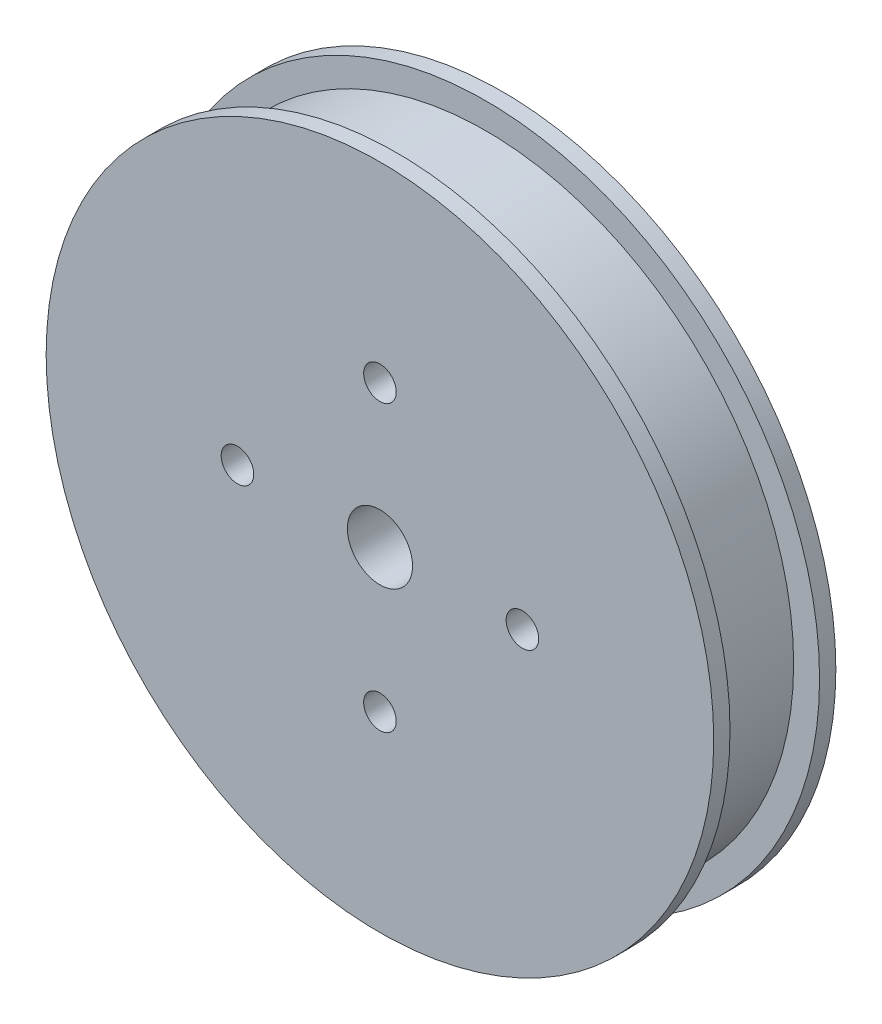
ISO-10303-21;
HEADER;
FILE_DESCRIPTION(('STEP AP214'),'2;1');
FILE_NAME('part.step','',(''),(''),'','','');
FILE_SCHEMA(('AUTOMOTIVE_DESIGN { 1 0 10303 214 1 1 1 1 }'));
ENDSEC;
DATA;
#1=APPLICATION_CONTEXT('core data for automotive mechanical design processes');
#2=APPLICATION_PROTOCOL_DEFINITION('international standard','automotive_design',2000,#1);
#3=PRODUCT_CONTEXT('',#1,'mechanical');
#4=PRODUCT('Part','Part','',(#3));
#5=PRODUCT_RELATED_PRODUCT_CATEGORY('part','',(#4));
#6=PRODUCT_DEFINITION_FORMATION('','',#4);
#7=PRODUCT_DEFINITION_CONTEXT('part definition',#1,'design');
#8=PRODUCT_DEFINITION('design','',#6,#7);
#9=PRODUCT_DEFINITION_SHAPE('','',#8);
#10=(LENGTH_UNIT() NAMED_UNIT(*) SI_UNIT(.MILLI.,.METRE.));
#11=(NAMED_UNIT(*) PLANE_ANGLE_UNIT() SI_UNIT($,.RADIAN.));
#12=(NAMED_UNIT(*) SI_UNIT($,.STERADIAN.) SOLID_ANGLE_UNIT());
#13=UNCERTAINTY_MEASURE_WITH_UNIT(LENGTH_MEASURE(1.E-05),#10,'distance_accuracy_value','');
#14=(GEOMETRIC_REPRESENTATION_CONTEXT(3) GLOBAL_UNCERTAINTY_ASSIGNED_CONTEXT((#13)) GLOBAL_UNIT_ASSIGNED_CONTEXT((#10,
#11,#12)) REPRESENTATION_CONTEXT('',''));
#15=CARTESIAN_POINT('',(0.,0.,0.));
#16=DIRECTION('',(0.,0.,1.));
#17=DIRECTION('',(1.,0.,0.));
#18=AXIS2_PLACEMENT_3D('',#15,#16,#17);
#19=CARTESIAN_POINT('',(0.,0.,15.));
#20=DIRECTION('',(0.,0.,-1.));
#21=DIRECTION('',(-1.,0.,0.));
#22=AXIS2_PLACEMENT_3D('',#19,#20,#21);
#23=CYLINDRICAL_SURFACE('',#22,41.);
#24=CARTESIAN_POINT('',(0.,0.,0.));
#25=DIRECTION('',(0.,0.,1.));
#26=DIRECTION('',(1.,0.,0.));
#27=AXIS2_PLACEMENT_3D('',#24,#25,#26);
#28=CIRCLE('',#27,41.);
#29=CARTESIAN_POINT('',(41.,0.,0.));
#30=VERTEX_POINT('',#29);
#31=EDGE_CURVE('E35',#30,#30,#28,.T.);
#32=ORIENTED_EDGE('',*,*,#31,.T.);
#33=EDGE_LOOP('',(#32));
#34=FACE_BOUND('',#33,.T.);
#35=CARTESIAN_POINT('',(0.,0.,2.));
#36=DIRECTION('',(0.,0.,1.));
#37=DIRECTION('',(1.,0.,0.));
#38=AXIS2_PLACEMENT_3D('',#35,#36,#37);
#39=CIRCLE('',#38,41.);
#40=CARTESIAN_POINT('',(41.,0.,2.));
#41=VERTEX_POINT('',#40);
#42=EDGE_CURVE('E71',#41,#41,#39,.T.);
#43=ORIENTED_EDGE('',*,*,#42,.F.);
#44=EDGE_LOOP('',(#43));
#45=FACE_BOUND('',#44,.T.);
#46=ADVANCED_FACE('F31',(#34,#45),#23,.T.);
#47=CARTESIAN_POINT('',(0.,0.,15.));
#48=DIRECTION('',(0.,0.,1.));
#49=DIRECTION('',(1.,0.,0.));
#50=AXIS2_PLACEMENT_3D('',#47,#48,#49);
#51=PLANE('',#50);
#52=CARTESIAN_POINT('',(17.5,0.,15.));
#53=DIRECTION('',(0.,0.,1.));
#54=DIRECTION('',(1.,0.,0.));
#55=AXIS2_PLACEMENT_3D('',#52,#53,#54);
#56=CIRCLE('',#55,2.);
#57=CARTESIAN_POINT('',(19.5,0.,15.));
#58=VERTEX_POINT('',#57);
#59=EDGE_CURVE('E59',#58,#58,#56,.T.);
#60=ORIENTED_EDGE('',*,*,#59,.F.);
#61=EDGE_LOOP('',(#60));
#62=FACE_BOUND('',#61,.T.);
#63=CARTESIAN_POINT('',(-17.5,0.,15.));
#64=DIRECTION('',(0.,0.,1.));
#65=DIRECTION('',(1.,0.,0.));
#66=AXIS2_PLACEMENT_3D('',#63,#64,#65);
#67=CIRCLE('',#66,2.);
#68=CARTESIAN_POINT('',(-15.5,0.,15.));
#69=VERTEX_POINT('',#68);
#70=EDGE_CURVE('E47',#69,#69,#67,.T.);
#71=ORIENTED_EDGE('',*,*,#70,.F.);
#72=EDGE_LOOP('',(#71));
#73=FACE_BOUND('',#72,.T.);
#74=CARTESIAN_POINT('',(0.,0.,15.));
#75=DIRECTION('',(0.,0.,1.));
#76=DIRECTION('',(1.,0.,0.));
#77=AXIS2_PLACEMENT_3D('',#74,#75,#76);
#78=CIRCLE('',#77,41.);
#79=CARTESIAN_POINT('',(41.,0.,15.));
#80=VERTEX_POINT('',#79);
#81=EDGE_CURVE('E10',#80,#80,#78,.T.);
#82=ORIENTED_EDGE('',*,*,#81,.T.);
#83=EDGE_LOOP('',(#82));
#84=FACE_BOUND('',#83,.T.);
#85=CARTESIAN_POINT('',(0.,0.,15.));
#86=DIRECTION('',(0.,0.,1.));
#87=DIRECTION('',(1.,0.,0.));
#88=AXIS2_PLACEMENT_3D('',#85,#86,#87);
#89=CIRCLE('',#88,4.);
#90=CARTESIAN_POINT('',(4.,0.,15.));
#91=VERTEX_POINT('',#90);
#92=EDGE_CURVE('E42',#91,#91,#89,.T.);
#93=ORIENTED_EDGE('',*,*,#92,.F.);
#94=EDGE_LOOP('',(#93));
#95=FACE_BOUND('',#94,.T.);
#96=CARTESIAN_POINT('',(0.,17.5,15.));
#97=DIRECTION('',(0.,0.,1.));
#98=DIRECTION('',(1.,0.,0.));
#99=AXIS2_PLACEMENT_3D('',#96,#97,#98);
#100=CIRCLE('',#99,2.);
#101=CARTESIAN_POINT('',(2.,17.5,15.));
#102=VERTEX_POINT('',#101);
#103=EDGE_CURVE('E53',#102,#102,#100,.T.);
#104=ORIENTED_EDGE('',*,*,#103,.F.);
#105=EDGE_LOOP('',(#104));
#106=FACE_BOUND('',#105,.T.);
#107=CARTESIAN_POINT('',(0.,-17.5,15.));
#108=DIRECTION('',(0.,0.,1.));
#109=DIRECTION('',(1.,0.,0.));
#110=AXIS2_PLACEMENT_3D('',#107,#108,#109);
#111=CIRCLE('',#110,2.);
#112=CARTESIAN_POINT('',(2.,-17.5,15.));
#113=VERTEX_POINT('',#112);
#114=EDGE_CURVE('E65',#113,#113,#111,.T.);
#115=ORIENTED_EDGE('',*,*,#114,.F.);
#116=EDGE_LOOP('',(#115));
#117=FACE_BOUND('',#116,.T.);
#118=ADVANCED_FACE('F98',(#62,#73,#84,#95,#106,#117),#51,.T.);
#119=CARTESIAN_POINT('',(0.,0.,0.));
#120=DIRECTION('',(0.,0.,1.));
#121=DIRECTION('',(1.,0.,0.));
#122=AXIS2_PLACEMENT_3D('',#119,#120,#121);
#123=PLANE('',#122);
#124=ORIENTED_EDGE('',*,*,#31,.F.);
#125=EDGE_LOOP('',(#124));
#126=FACE_BOUND('',#125,.T.);
#127=CARTESIAN_POINT('',(0.,0.,0.));
#128=DIRECTION('',(0.,0.,1.));
#129=DIRECTION('',(1.,0.,0.));
#130=AXIS2_PLACEMENT_3D('',#127,#128,#129);
#131=CIRCLE('',#130,4.);
#132=CARTESIAN_POINT('',(4.,0.,0.));
#133=VERTEX_POINT('',#132);
#134=EDGE_CURVE('E44',#133,#133,#131,.T.);
#135=ORIENTED_EDGE('',*,*,#134,.T.);
#136=EDGE_LOOP('',(#135));
#137=FACE_BOUND('',#136,.T.);
#138=CARTESIAN_POINT('',(-17.5,0.,0.));
#139=DIRECTION('',(0.,0.,1.));
#140=DIRECTION('',(1.,0.,0.));
#141=AXIS2_PLACEMENT_3D('',#138,#139,#140);
#142=CIRCLE('',#141,2.);
#143=CARTESIAN_POINT('',(-15.5,0.,0.));
#144=VERTEX_POINT('',#143);
#145=EDGE_CURVE('E50',#144,#144,#142,.T.);
#146=ORIENTED_EDGE('',*,*,#145,.T.);
#147=EDGE_LOOP('',(#146));
#148=FACE_BOUND('',#147,.T.);
#149=CARTESIAN_POINT('',(0.,17.5,0.));
#150=DIRECTION('',(0.,0.,1.));
#151=DIRECTION('',(1.,0.,0.));
#152=AXIS2_PLACEMENT_3D('',#149,#150,#151);
#153=CIRCLE('',#152,2.);
#154=CARTESIAN_POINT('',(2.,17.5,0.));
#155=VERTEX_POINT('',#154);
#156=EDGE_CURVE('E56',#155,#155,#153,.T.);
#157=ORIENTED_EDGE('',*,*,#156,.T.);
#158=EDGE_LOOP('',(#157));
#159=FACE_BOUND('',#158,.T.);
#160=CARTESIAN_POINT('',(17.5,0.,0.));
#161=DIRECTION('',(0.,0.,1.));
#162=DIRECTION('',(1.,0.,0.));
#163=AXIS2_PLACEMENT_3D('',#160,#161,#162);
#164=CIRCLE('',#163,2.);
#165=CARTESIAN_POINT('',(19.5,0.,0.));
#166=VERTEX_POINT('',#165);
#167=EDGE_CURVE('E62',#166,#166,#164,.T.);
#168=ORIENTED_EDGE('',*,*,#167,.T.);
#169=EDGE_LOOP('',(#168));
#170=FACE_BOUND('',#169,.T.);
#171=CARTESIAN_POINT('',(0.,-17.5,0.));
#172=DIRECTION('',(0.,0.,1.));
#173=DIRECTION('',(1.,0.,0.));
#174=AXIS2_PLACEMENT_3D('',#171,#172,#173);
#175=CIRCLE('',#174,2.);
#176=CARTESIAN_POINT('',(2.,-17.5,0.));
#177=VERTEX_POINT('',#176);
#178=EDGE_CURVE('E68',#177,#177,#175,.T.);
#179=ORIENTED_EDGE('',*,*,#178,.T.);
#180=EDGE_LOOP('',(#179));
#181=FACE_BOUND('',#180,.T.);
#182=ADVANCED_FACE('F103',(#126,#137,#148,#159,#170,#181),#123,.F.);
#183=CARTESIAN_POINT('',(0.,0.,13.));
#184=DIRECTION('',(0.,0.,1.));
#185=DIRECTION('',(1.,0.,0.));
#186=AXIS2_PLACEMENT_3D('',#183,#184,#185);
#187=CIRCLE('',#186,41.);
#188=CARTESIAN_POINT('',(41.,0.,13.));
#189=VERTEX_POINT('',#188);
#190=EDGE_CURVE('E74',#189,#189,#187,.T.);
#191=ORIENTED_EDGE('',*,*,#190,.T.);
#192=EDGE_LOOP('',(#191));
#193=FACE_BOUND('',#192,.T.);
#194=ORIENTED_EDGE('',*,*,#81,.F.);
#195=EDGE_LOOP('',(#194));
#196=FACE_BOUND('',#195,.T.);
#197=ADVANCED_FACE('F33',(#193,#196),#23,.T.);
#198=CARTESIAN_POINT('',(0.,0.,15.));
#199=DIRECTION('',(0.,0.,-1.));
#200=DIRECTION('',(-1.,0.,0.));
#201=AXIS2_PLACEMENT_3D('',#198,#199,#200);
#202=CYLINDRICAL_SURFACE('',#201,4.);
#203=ORIENTED_EDGE('',*,*,#92,.T.);
#204=EDGE_LOOP('',(#203));
#205=FACE_BOUND('',#204,.T.);
#206=ORIENTED_EDGE('',*,*,#134,.F.);
#207=EDGE_LOOP('',(#206));
#208=FACE_BOUND('',#207,.T.);
#209=ADVANCED_FACE('F107',(#205,#208),#202,.F.);
#210=CARTESIAN_POINT('',(-17.5,0.,15.));
#211=DIRECTION('',(0.,0.,-1.));
#212=DIRECTION('',(-1.,0.,0.));
#213=AXIS2_PLACEMENT_3D('',#210,#211,#212);
#214=CYLINDRICAL_SURFACE('',#213,2.);
#215=ORIENTED_EDGE('',*,*,#70,.T.);
#216=EDGE_LOOP('',(#215));
#217=FACE_BOUND('',#216,.T.);
#218=ORIENTED_EDGE('',*,*,#145,.F.);
#219=EDGE_LOOP('',(#218));
#220=FACE_BOUND('',#219,.T.);
#221=ADVANCED_FACE('F113',(#217,#220),#214,.F.);
#222=CARTESIAN_POINT('',(0.,17.5,15.));
#223=DIRECTION('',(0.,0.,-1.));
#224=DIRECTION('',(-1.,0.,0.));
#225=AXIS2_PLACEMENT_3D('',#222,#223,#224);
#226=CYLINDRICAL_SURFACE('',#225,2.);
#227=ORIENTED_EDGE('',*,*,#103,.T.);
#228=EDGE_LOOP('',(#227));
#229=FACE_BOUND('',#228,.T.);
#230=ORIENTED_EDGE('',*,*,#156,.F.);
#231=EDGE_LOOP('',(#230));
#232=FACE_BOUND('',#231,.T.);
#233=ADVANCED_FACE('F134',(#229,#232),#226,.F.);
#234=CARTESIAN_POINT('',(17.5,0.,15.));
#235=DIRECTION('',(0.,0.,-1.));
#236=DIRECTION('',(-1.,0.,0.));
#237=AXIS2_PLACEMENT_3D('',#234,#235,#236);
#238=CYLINDRICAL_SURFACE('',#237,2.);
#239=ORIENTED_EDGE('',*,*,#59,.T.);
#240=EDGE_LOOP('',(#239));
#241=FACE_BOUND('',#240,.T.);
#242=ORIENTED_EDGE('',*,*,#167,.F.);
#243=EDGE_LOOP('',(#242));
#244=FACE_BOUND('',#243,.T.);
#245=ADVANCED_FACE('F130',(#241,#244),#238,.F.);
#246=CARTESIAN_POINT('',(0.,-17.5,15.));
#247=DIRECTION('',(0.,0.,-1.));
#248=DIRECTION('',(-1.,0.,0.));
#249=AXIS2_PLACEMENT_3D('',#246,#247,#248);
#250=CYLINDRICAL_SURFACE('',#249,2.);
#251=ORIENTED_EDGE('',*,*,#114,.T.);
#252=EDGE_LOOP('',(#251));
#253=FACE_BOUND('',#252,.T.);
#254=ORIENTED_EDGE('',*,*,#178,.F.);
#255=EDGE_LOOP('',(#254));
#256=FACE_BOUND('',#255,.T.);
#257=ADVANCED_FACE('F93',(#253,#256),#250,.F.);
#258=CARTESIAN_POINT('',(0.,0.,2.));
#259=DIRECTION('',(0.,0.,1.));
#260=DIRECTION('',(1.,0.,0.));
#261=AXIS2_PLACEMENT_3D('',#258,#259,#260);
#262=PLANE('',#261);
#263=CARTESIAN_POINT('',(0.,0.,2.));
#264=DIRECTION('',(0.,0.,1.));
#265=DIRECTION('',(1.,0.,0.));
#266=AXIS2_PLACEMENT_3D('',#263,#264,#265);
#267=CIRCLE('',#266,37.815);
#268=CARTESIAN_POINT('',(37.815,0.,2.));
#269=VERTEX_POINT('',#268);
#270=EDGE_CURVE('E77',#269,#269,#267,.T.);
#271=ORIENTED_EDGE('',*,*,#270,.F.);
#272=EDGE_LOOP('',(#271));
#273=FACE_BOUND('',#272,.T.);
#274=ORIENTED_EDGE('',*,*,#42,.T.);
#275=EDGE_LOOP('',(#274));
#276=FACE_BOUND('',#275,.T.);
#277=ADVANCED_FACE('F89',(#273,#276),#262,.T.);
#278=CARTESIAN_POINT('',(0.,0.,13.));
#279=DIRECTION('',(0.,0.,1.));
#280=DIRECTION('',(1.,0.,0.));
#281=AXIS2_PLACEMENT_3D('',#278,#279,#280);
#282=PLANE('',#281);
#283=CARTESIAN_POINT('',(0.,0.,13.));
#284=DIRECTION('',(0.,0.,1.));
#285=DIRECTION('',(1.,0.,0.));
#286=AXIS2_PLACEMENT_3D('',#283,#284,#285);
#287=CIRCLE('',#286,37.815);
#288=CARTESIAN_POINT('',(37.815,0.,13.));
#289=VERTEX_POINT('',#288);
#290=EDGE_CURVE('E80',#289,#289,#287,.T.);
#291=ORIENTED_EDGE('',*,*,#290,.T.);
#292=EDGE_LOOP('',(#291));
#293=FACE_BOUND('',#292,.T.);
#294=ORIENTED_EDGE('',*,*,#190,.F.);
#295=EDGE_LOOP('',(#294));
#296=FACE_BOUND('',#295,.T.);
#297=ADVANCED_FACE('F92',(#293,#296),#282,.F.);
#298=CARTESIAN_POINT('',(0.,0.,2.));
#299=DIRECTION('',(0.,0.,1.));
#300=DIRECTION('',(1.,0.,0.));
#301=AXIS2_PLACEMENT_3D('',#298,#299,#300);
#302=CYLINDRICAL_SURFACE('',#301,37.815);
#303=ORIENTED_EDGE('',*,*,#270,.T.);
#304=EDGE_LOOP('',(#303));
#305=FACE_BOUND('',#304,.T.);
#306=ORIENTED_EDGE('',*,*,#290,.F.);
#307=EDGE_LOOP('',(#306));
#308=FACE_BOUND('',#307,.T.);
#309=ADVANCED_FACE('F86',(#305,#308),#302,.T.);
#310=CLOSED_SHELL('',(#46,#118,#182,#197,#209,#221,#233,#245,#257,#277,#297,#309));
#311=MANIFOLD_SOLID_BREP('B2',#310);
#312=ADVANCED_BREP_SHAPE_REPRESENTATION('',(#18,#311),#14);
#313=SHAPE_DEFINITION_REPRESENTATION(#9,#312);
ENDSEC;
END-ISO-10303-21;
